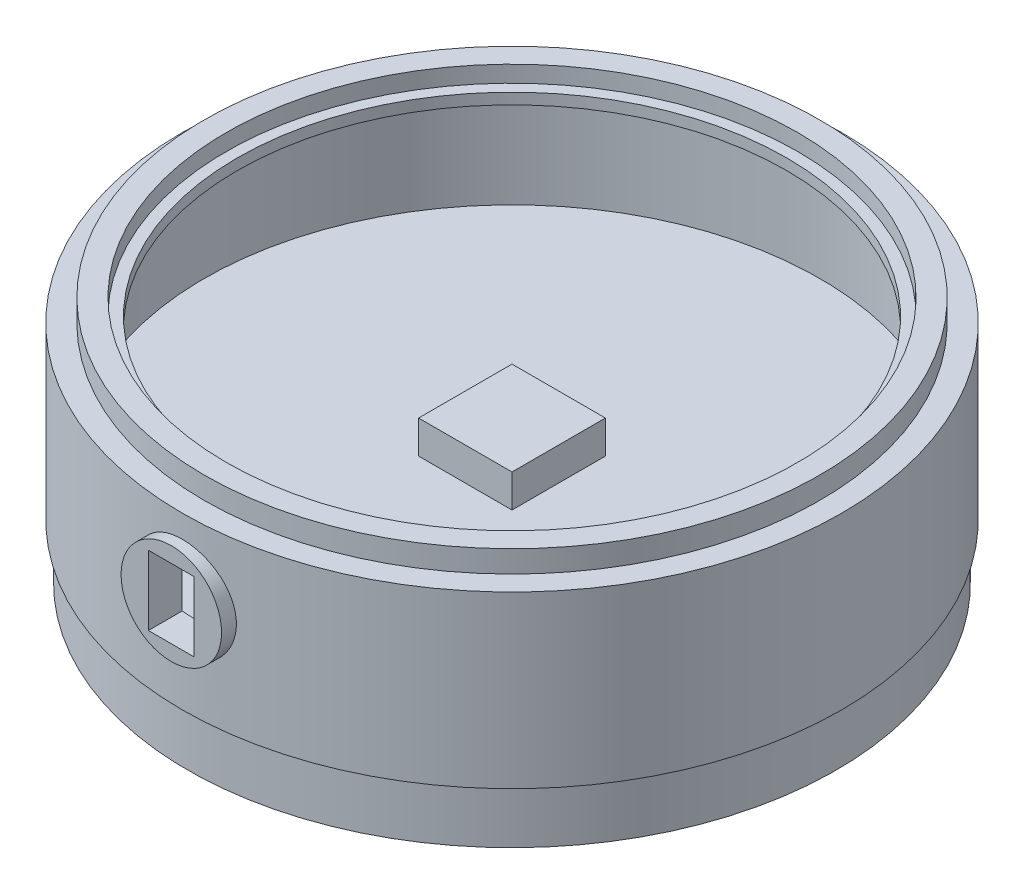
ISO-10303-21;
HEADER;
FILE_DESCRIPTION(('STEP AP214'),'2;1');
FILE_NAME('part.step','',(''),(''),'','','');
FILE_SCHEMA(('AUTOMOTIVE_DESIGN { 1 0 10303 214 1 1 1 1 }'));
ENDSEC;
DATA;
#1=APPLICATION_CONTEXT('core data for automotive mechanical design processes');
#2=APPLICATION_PROTOCOL_DEFINITION('international standard','automotive_design',2000,#1);
#3=PRODUCT_CONTEXT('',#1,'mechanical');
#4=PRODUCT('Part','Part','',(#3));
#5=PRODUCT_RELATED_PRODUCT_CATEGORY('part','',(#4));
#6=PRODUCT_DEFINITION_FORMATION('','',#4);
#7=PRODUCT_DEFINITION_CONTEXT('part definition',#1,'design');
#8=PRODUCT_DEFINITION('design','',#6,#7);
#9=PRODUCT_DEFINITION_SHAPE('','',#8);
#10=(LENGTH_UNIT() NAMED_UNIT(*) SI_UNIT(.MILLI.,.METRE.));
#11=(NAMED_UNIT(*) PLANE_ANGLE_UNIT() SI_UNIT($,.RADIAN.));
#12=(NAMED_UNIT(*) SI_UNIT($,.STERADIAN.) SOLID_ANGLE_UNIT());
#13=UNCERTAINTY_MEASURE_WITH_UNIT(LENGTH_MEASURE(1.E-05),#10,'distance_accuracy_value','');
#14=(GEOMETRIC_REPRESENTATION_CONTEXT(3) GLOBAL_UNCERTAINTY_ASSIGNED_CONTEXT((#13)) GLOBAL_UNIT_ASSIGNED_CONTEXT((#10,
#11,#12)) REPRESENTATION_CONTEXT('',''));
#15=CARTESIAN_POINT('',(0.,0.,0.));
#16=DIRECTION('',(0.,0.,1.));
#17=DIRECTION('',(1.,0.,0.));
#18=AXIS2_PLACEMENT_3D('',#15,#16,#17);
#19=CARTESIAN_POINT('',(0.,1.,0.));
#20=DIRECTION('',(0.,-1.,0.));
#21=DIRECTION('',(0.,0.,-1.));
#22=AXIS2_PLACEMENT_3D('',#19,#20,#21);
#23=CYLINDRICAL_SURFACE('',#22,30.);
#24=CARTESIAN_POINT('',(-4.57128351329621,4.87657137802899,29.6496773513822));
#25=CARTESIAN_POINT('',(-4.57127301041782,4.62140468608867,29.6496816686007));
#26=CARTESIAN_POINT('',(-4.54984634202305,4.36609106832264,29.6530069682925));
#27=CARTESIAN_POINT('',(-4.4647305253347,3.86260558423603,29.6659394465184));
#28=CARTESIAN_POINT('',(-4.40100046115678,3.61444087504676,29.6755527066421));
#29=CARTESIAN_POINT('',(-4.23323175713461,3.13261374106515,29.6999475781639));
#30=CARTESIAN_POINT('',(-4.12922442653793,2.8989402149379,29.7147251742336));
#31=CARTESIAN_POINT('',(-3.88392790063985,2.4523936386219,29.7477788918514));
#32=CARTESIAN_POINT('',(-3.74264370958909,2.23951780168941,29.7660545437109));
#33=CARTESIAN_POINT('',(-3.42555819371333,1.83881951464776,29.8042138943566));
#34=CARTESIAN_POINT('',(-3.2495096359498,1.65119371914194,29.8241084730564));
#35=CARTESIAN_POINT('',(-2.86842668013691,1.30802623278326,29.8631670156701));
#36=CARTESIAN_POINT('',(-2.66339067286469,1.15248632434101,29.8823309389469));
#37=CARTESIAN_POINT('',(-2.2288911866794,0.877178485214907,29.9178829288948));
#38=CARTESIAN_POINT('',(-1.9993115276183,0.757591916891196,29.9342567473633));
#39=CARTESIAN_POINT('',(-1.52303357494446,0.558749501265131,29.9622630597163));
#40=CARTESIAN_POINT('',(-1.27633621496823,0.479491456319482,29.9738958119512));
#41=CARTESIAN_POINT('',(-0.774851902169283,0.36415282088342,29.9910325342108));
#42=CARTESIAN_POINT('',(-0.520142348716236,0.327742760838744,29.9965832475535));
#43=CARTESIAN_POINT('',(-0.00817265953639558,0.298110414592141,30.0010907344831));
#44=CARTESIAN_POINT('',(0.249087329248261,0.30488565456195,30.000047885776));
#45=CARTESIAN_POINT('',(0.756606722920194,0.36117199704645,29.9915230505634));
#46=CARTESIAN_POINT('',(1.00690646531056,0.410328625681076,29.9840944751873));
#47=CARTESIAN_POINT('',(1.49566262949781,0.549425718522067,29.963692372498));
#48=CARTESIAN_POINT('',(1.73411873841662,0.639367259524848,29.9507186987846));
#49=CARTESIAN_POINT('',(2.19348908992412,0.857842503468263,29.9205924443587));
#50=CARTESIAN_POINT('',(2.4143314701812,0.986525000424018,29.9034238006259));
#51=CARTESIAN_POINT('',(2.83142192865304,1.27872064659033,29.8668202285723));
#52=CARTESIAN_POINT('',(3.02766833562262,1.44223616059611,29.8473851464249));
#53=CARTESIAN_POINT('',(3.39208630502824,1.80142975323664,29.808182533445));
#54=CARTESIAN_POINT('',(3.55995277030081,1.99741736387359,29.7884136303538));
#55=CARTESIAN_POINT('',(3.8604621419876,2.41494133315086,29.7509636134504));
#56=CARTESIAN_POINT('',(3.99310481814802,2.63647785878788,29.7332825132865));
#57=CARTESIAN_POINT('',(4.21944514866642,3.09913394997064,29.7020102273075));
#58=CARTESIAN_POINT('',(4.31311070976148,3.34026945858664,29.6884224143846));
#59=CARTESIAN_POINT('',(4.45852715107097,3.83510273441333,29.6669342887907));
#60=CARTESIAN_POINT('',(4.51028108455908,4.08879958509768,29.6590335618186));
#61=CARTESIAN_POINT('',(4.56998520926932,4.5988374388159,29.6498929488384));
#62=CARTESIAN_POINT('',(4.57836822678681,4.85512663708962,29.6485872499266));
#63=CARTESIAN_POINT('',(4.55224171586691,5.36544944156672,29.6526097214045));
#64=CARTESIAN_POINT('',(4.51773356238559,5.61948311981207,29.6579376791402));
#65=CARTESIAN_POINT('',(4.40717163039077,6.11673825471529,29.6745666319488));
#66=CARTESIAN_POINT('',(4.33133412630413,6.3600089300961,29.6858365232762));
#67=CARTESIAN_POINT('',(4.14049146874135,6.83038606048386,29.713053796019));
#68=CARTESIAN_POINT('',(4.02548432429745,7.05749169312247,29.7290014151946));
#69=CARTESIAN_POINT('',(3.75852960978617,7.49103037978089,29.763932006389));
#70=CARTESIAN_POINT('',(3.60630224221289,7.69728929391737,29.7829375775935));
#71=CARTESIAN_POINT('',(3.26961654410956,8.08148809099654,29.8217748273108));
#72=CARTESIAN_POINT('',(3.08515633092791,8.25942631862784,29.841606554026));
#73=CARTESIAN_POINT('',(2.68733336484049,8.58349071200482,29.8800676046522));
#74=CARTESIAN_POINT('',(2.47373543762412,8.72932978785547,29.8986851058355));
#75=CARTESIAN_POINT('',(2.02482075355444,8.98305439128368,29.932435493896));
#76=CARTESIAN_POINT('',(1.7895046064642,9.09094098401028,29.9475684785631));
#77=CARTESIAN_POINT('',(1.30472362846758,9.26524102900487,29.9725930104253));
#78=CARTESIAN_POINT('',(1.05531596360694,9.3318105291861,29.9825042575539));
#79=CARTESIAN_POINT('',(0.548699612394618,9.42209140979869,29.9960513606146));
#80=CARTESIAN_POINT('',(0.29149145966533,9.44580571521041,29.9996876448287));
#81=CARTESIAN_POINT('',(-0.220642073874038,9.44962990792313,30.0002705792239));
#82=CARTESIAN_POINT('',(-0.475564208890887,9.43017872624076,29.9972845688259));
#83=CARTESIAN_POINT('',(-0.97846751650046,9.34916608701204,29.9850944415479));
#84=CARTESIAN_POINT('',(-1.22644871340576,9.28760477698741,29.9758903464514));
#85=CARTESIAN_POINT('',(-1.70830386852594,9.12427686807188,29.952293567605));
#86=CARTESIAN_POINT('',(-1.94218866196511,9.02254161521096,29.9379049298991));
#87=CARTESIAN_POINT('',(-2.38963727848329,8.78180079418725,29.9055181343826));
#88=CARTESIAN_POINT('',(-2.60320039925514,8.64279393856931,29.8875198518912));
#89=CARTESIAN_POINT('',(-3.00616766626774,8.32987288420999,29.8496963114907));
#90=CARTESIAN_POINT('',(-3.1953189464196,8.15563495152314,29.8298551074528));
#91=CARTESIAN_POINT('',(-3.54185748289756,7.77787879636195,29.7906988467171));
#92=CARTESIAN_POINT('',(-3.69923727750896,7.57435371481219,29.7713839145365));
#93=CARTESIAN_POINT('',(-3.97858959559306,7.14240755730821,29.7353465947231));
#94=CARTESIAN_POINT('',(-4.10035101801842,6.91384866210861,29.7186399272385));
#95=CARTESIAN_POINT('',(-4.30357372348156,6.43937478600913,29.6898952233063));
#96=CARTESIAN_POINT('',(-4.38507661678129,6.19347802687491,29.6778523692448));
#97=CARTESIAN_POINT('',(-4.48707986783159,5.76817555734159,29.6625660165613));
#98=CARTESIAN_POINT('',(-4.51860760398284,5.59138994501629,29.6577585618623));
#99=CARTESIAN_POINT('',(-4.5607129761213,5.23528419831546,29.651312733248));
#100=CARTESIAN_POINT('',(-4.57129089725338,5.05596409846992,29.6496743161993));
#101=CARTESIAN_POINT('',(-4.57128351329621,4.87657137802899,29.6496773513822));
#102=B_SPLINE_CURVE_WITH_KNOTS('',3,(#24,#25,#26,#27,#28,#29,#30,#31,#32,#33,#34,#35,#36,#37,
#38,#39,#40,#41,#42,#43,#44,#45,#46,#47,#48,#49,#50,#51,#52,#53,#54,#55,#56,#57,#58,#59,#60,#61,
#62,#63,#64,#65,#66,#67,#68,#69,#70,#71,#72,#73,#74,#75,#76,#77,#78,#79,#80,#81,#82,#83,#84,#85,
#86,#87,#88,#89,#90,#91,#92,#93,#94,#95,#96,#97,#98,#99,#100,#101),.UNSPECIFIED.,.T.,.F.,(4,2,2,
2,2,2,2,2,2,2,2,2,2,2,2,2,2,2,2,2,2,2,2,2,2,2,2,2,2,2,2,2,2,2,2,2,2,2,4),(0.,0.764844334076842,
1.53042950631194,2.29542074708845,3.06030934344287,3.83084733301412,4.60142811540155,
5.37583318435185,6.15019604872141,6.91856489751777,7.68688973144126,8.44885003058193,
9.21083044804199,9.97577560295475,10.7407727061519,11.5135326136685,12.286297572502,
13.0596975631983,13.8330412064211,14.5986520593528,15.3642383698411,16.1258563460655,
16.8875130406233,17.6550816049616,18.422695016333,19.1969175155182,19.9711182841585,
20.742376940156,21.5135829537223,22.2769828782668,23.0403801284548,23.8031829052473,
24.5660120345665,25.3361982691693,26.1065651765113,26.8814094108303,27.6554510999324,
28.1931755666722,28.7308927144729),.UNSPECIFIED.);
#103=CARTESIAN_POINT('',(-4.57128351329621,4.87657137802899,29.6496773513822));
#104=VERTEX_POINT('',#103);
#105=EDGE_CURVE('E58',#104,#104,#102,.T.);
#106=ORIENTED_EDGE('',*,*,#105,.F.);
#107=EDGE_LOOP('',(#106));
#108=FACE_BOUND('',#107,.T.);
#109=CARTESIAN_POINT('',(0.,11.5,0.));
#110=DIRECTION('',(0.,1.,0.));
#111=DIRECTION('',(0.,0.,1.));
#112=AXIS2_PLACEMENT_3D('',#109,#110,#111);
#113=CIRCLE('',#112,30.);
#114=CARTESIAN_POINT('',(0.,11.5,30.));
#115=VERTEX_POINT('',#114);
#116=EDGE_CURVE('E53',#115,#115,#113,.T.);
#117=ORIENTED_EDGE('',*,*,#116,.F.);
#118=EDGE_LOOP('',(#117));
#119=FACE_BOUND('',#118,.T.);
#120=CARTESIAN_POINT('',(0.,-4.,0.));
#121=DIRECTION('',(0.,-1.,0.));
#122=DIRECTION('',(0.,0.,-1.));
#123=AXIS2_PLACEMENT_3D('',#120,#121,#122);
#124=CIRCLE('',#123,30.);
#125=CARTESIAN_POINT('',(0.,-4.,-30.));
#126=VERTEX_POINT('',#125);
#127=EDGE_CURVE('E251',#126,#126,#124,.T.);
#128=ORIENTED_EDGE('',*,*,#127,.F.);
#129=EDGE_LOOP('',(#128));
#130=FACE_BOUND('',#129,.T.);
#131=ADVANCED_FACE('F49',(#108,#119,#130),#23,.T.);
#132=CARTESIAN_POINT('',(0.,13.5,0.));
#133=DIRECTION('',(0.,1.,0.));
#134=DIRECTION('',(0.,0.,1.));
#135=AXIS2_PLACEMENT_3D('',#132,#133,#134);
#136=PLANE('',#135);
#137=CARTESIAN_POINT('',(0.,13.5,0.));
#138=DIRECTION('',(0.,1.,0.));
#139=DIRECTION('',(0.,0.,1.));
#140=AXIS2_PLACEMENT_3D('',#137,#138,#139);
#141=CIRCLE('',#140,26.);
#142=CARTESIAN_POINT('',(0.,13.5,26.));
#143=VERTEX_POINT('',#142);
#144=EDGE_CURVE('E266',#143,#143,#141,.T.);
#145=ORIENTED_EDGE('',*,*,#144,.F.);
#146=EDGE_LOOP('',(#145));
#147=FACE_BOUND('',#146,.T.);
#148=CARTESIAN_POINT('',(0.,13.5,0.));
#149=DIRECTION('',(0.,1.,0.));
#150=DIRECTION('',(0.,0.,1.));
#151=AXIS2_PLACEMENT_3D('',#148,#149,#150);
#152=CIRCLE('',#151,28.);
#153=CARTESIAN_POINT('',(0.,13.5,28.));
#154=VERTEX_POINT('',#153);
#155=EDGE_CURVE('E253',#154,#154,#152,.T.);
#156=ORIENTED_EDGE('',*,*,#155,.T.);
#157=EDGE_LOOP('',(#156));
#158=FACE_BOUND('',#157,.T.);
#159=ADVANCED_FACE('F231',(#147,#158),#136,.T.);
#160=CARTESIAN_POINT('',(0.,12.,0.));
#161=DIRECTION('',(0.,1.,0.));
#162=DIRECTION('',(0.,0.,1.));
#163=AXIS2_PLACEMENT_3D('',#160,#161,#162);
#164=PLANE('',#163);
#165=CARTESIAN_POINT('',(0.,12.,0.));
#166=DIRECTION('',(0.,1.,0.));
#167=DIRECTION('',(0.,0.,1.));
#168=AXIS2_PLACEMENT_3D('',#165,#166,#167);
#169=CIRCLE('',#168,25.);
#170=CARTESIAN_POINT('',(0.,12.,25.));
#171=VERTEX_POINT('',#170);
#172=EDGE_CURVE('E187',#171,#171,#169,.T.);
#173=ORIENTED_EDGE('',*,*,#172,.F.);
#174=EDGE_LOOP('',(#173));
#175=FACE_BOUND('',#174,.T.);
#176=CARTESIAN_POINT('',(0.,12.,0.));
#177=DIRECTION('',(0.,1.,0.));
#178=DIRECTION('',(0.,0.,1.));
#179=AXIS2_PLACEMENT_3D('',#176,#177,#178);
#180=CIRCLE('',#179,26.);
#181=CARTESIAN_POINT('',(0.,12.,26.));
#182=VERTEX_POINT('',#181);
#183=EDGE_CURVE('E270',#182,#182,#180,.T.);
#184=ORIENTED_EDGE('',*,*,#183,.T.);
#185=EDGE_LOOP('',(#184));
#186=FACE_BOUND('',#185,.T.);
#187=ADVANCED_FACE('F226',(#175,#186),#164,.T.);
#188=CARTESIAN_POINT('',(0.,1.,0.));
#189=DIRECTION('',(0.,1.,0.));
#190=DIRECTION('',(0.,0.,1.));
#191=AXIS2_PLACEMENT_3D('',#188,#189,#190);
#192=PLANE('',#191);
#193=CARTESIAN_POINT('',(0.,1.,0.));
#194=DIRECTION('',(0.,1.,0.));
#195=DIRECTION('',(0.,0.,1.));
#196=AXIS2_PLACEMENT_3D('',#193,#194,#195);
#197=CIRCLE('',#196,28.);
#198=CARTESIAN_POINT('',(0.,1.,28.));
#199=VERTEX_POINT('',#198);
#200=EDGE_CURVE('E183',#199,#199,#197,.F.);
#201=ORIENTED_EDGE('',*,*,#200,.F.);
#202=EDGE_LOOP('',(#201));
#203=FACE_BOUND('',#202,.T.);
#204=DIRECTION('',(-1.,0.,0.));
#205=VECTOR('',#204,1.);
#206=CARTESIAN_POINT('',(-4.25,1.,-4.25));
#207=LINE('',#206,#205);
#208=CARTESIAN_POINT('',(4.25,1.,-4.25));
#209=VERTEX_POINT('',#208);
#210=CARTESIAN_POINT('',(-4.25,1.,-4.25));
#211=VERTEX_POINT('',#210);
#212=EDGE_CURVE('E168',#209,#211,#207,.T.);
#213=ORIENTED_EDGE('',*,*,#212,.F.);
#214=DIRECTION('',(0.,0.,-1.));
#215=VECTOR('',#214,1.);
#216=CARTESIAN_POINT('',(4.25,1.,4.25));
#217=LINE('',#216,#215);
#218=CARTESIAN_POINT('',(4.25,1.,4.25));
#219=VERTEX_POINT('',#218);
#220=EDGE_CURVE('E154',#219,#209,#217,.T.);
#221=ORIENTED_EDGE('',*,*,#220,.F.);
#222=DIRECTION('',(1.,0.,0.));
#223=VECTOR('',#222,1.);
#224=CARTESIAN_POINT('',(-4.25,1.,4.25));
#225=LINE('',#224,#223);
#226=CARTESIAN_POINT('',(-4.25,1.,4.25));
#227=VERTEX_POINT('',#226);
#228=EDGE_CURVE('E159',#227,#219,#225,.T.);
#229=ORIENTED_EDGE('',*,*,#228,.F.);
#230=DIRECTION('',(0.,0.,1.));
#231=VECTOR('',#230,1.);
#232=CARTESIAN_POINT('',(-4.25,1.,4.25));
#233=LINE('',#232,#231);
#234=EDGE_CURVE('E170',#211,#227,#233,.T.);
#235=ORIENTED_EDGE('',*,*,#234,.F.);
#236=EDGE_LOOP('',(#213,#221,#229,#235));
#237=FACE_BOUND('',#236,.T.);
#238=ADVANCED_FACE('F223',(#203,#237),#192,.T.);
#239=CARTESIAN_POINT('',(0.,11.,0.));
#240=DIRECTION('',(0.,-1.,0.));
#241=DIRECTION('',(0.,0.,-1.));
#242=AXIS2_PLACEMENT_3D('',#239,#240,#241);
#243=CYLINDRICAL_SURFACE('',#242,28.);
#244=DIRECTION('',(0.,-1.,0.));
#245=VECTOR('',#244,1.);
#246=CARTESIAN_POINT('',(2.08712233169295,11.,27.9221045118836));
#247=LINE('',#246,#245);
#248=CARTESIAN_POINT('',(2.08712233169295,8.03986616200132,27.9221045118836));
#249=VERTEX_POINT('',#248);
#250=CARTESIAN_POINT('',(2.08712233169295,1.71327659405666,27.9221045118836));
#251=VERTEX_POINT('',#250);
#252=EDGE_CURVE('E149',#249,#251,#247,.T.);
#253=ORIENTED_EDGE('',*,*,#252,.F.);
#254=CARTESIAN_POINT('',(0.,8.03986616200132,0.));
#255=DIRECTION('',(0.,1.,0.));
#256=DIRECTION('',(0.,0.,1.));
#257=AXIS2_PLACEMENT_3D('',#254,#255,#256);
#258=CIRCLE('',#257,28.);
#259=CARTESIAN_POINT('',(-2.08712233169295,8.03986616200132,27.9221045118836));
#260=VERTEX_POINT('',#259);
#261=EDGE_CURVE('E142',#260,#249,#258,.T.);
#262=ORIENTED_EDGE('',*,*,#261,.F.);
#263=DIRECTION('',(0.,-1.,0.));
#264=VECTOR('',#263,1.);
#265=CARTESIAN_POINT('',(-2.08712233169295,11.,27.9221045118836));
#266=LINE('',#265,#264);
#267=CARTESIAN_POINT('',(-2.08712233169295,1.71327659405666,27.9221045118836));
#268=VERTEX_POINT('',#267);
#269=EDGE_CURVE('E122',#268,#260,#266,.F.);
#270=ORIENTED_EDGE('',*,*,#269,.F.);
#271=CARTESIAN_POINT('',(0.,1.71327659405666,0.));
#272=DIRECTION('',(0.,-1.,0.));
#273=DIRECTION('',(0.,0.,-1.));
#274=AXIS2_PLACEMENT_3D('',#271,#272,#273);
#275=CIRCLE('',#274,28.);
#276=EDGE_CURVE('E147',#251,#268,#275,.T.);
#277=ORIENTED_EDGE('',*,*,#276,.F.);
#278=EDGE_LOOP('',(#253,#262,#270,#277));
#279=FACE_BOUND('',#278,.T.);
#280=CARTESIAN_POINT('',(0.,11.,0.));
#281=DIRECTION('',(0.,1.,0.));
#282=DIRECTION('',(0.,0.,1.));
#283=AXIS2_PLACEMENT_3D('',#280,#281,#282);
#284=CIRCLE('',#283,28.);
#285=CARTESIAN_POINT('',(0.,11.,28.));
#286=VERTEX_POINT('',#285);
#287=EDGE_CURVE('E184',#286,#286,#284,.T.);
#288=ORIENTED_EDGE('',*,*,#287,.T.);
#289=EDGE_LOOP('',(#288));
#290=FACE_BOUND('',#289,.T.);
#291=ORIENTED_EDGE('',*,*,#200,.T.);
#292=EDGE_LOOP('',(#291));
#293=FACE_BOUND('',#292,.T.);
#294=ADVANCED_FACE('F220',(#279,#290,#293),#243,.F.);
#295=CARTESIAN_POINT('',(4.25,4.,4.25));
#296=DIRECTION('',(-1.,0.,0.));
#297=DIRECTION('',(0.,0.,1.));
#298=AXIS2_PLACEMENT_3D('',#295,#296,#297);
#299=PLANE('',#298);
#300=ORIENTED_EDGE('',*,*,#220,.T.);
#301=DIRECTION('',(0.,-1.,0.));
#302=VECTOR('',#301,1.);
#303=CARTESIAN_POINT('',(4.25,4.,-4.25));
#304=LINE('',#303,#302);
#305=CARTESIAN_POINT('',(4.25,4.,-4.25));
#306=VERTEX_POINT('',#305);
#307=EDGE_CURVE('E181',#306,#209,#304,.T.);
#308=ORIENTED_EDGE('',*,*,#307,.F.);
#309=DIRECTION('',(0.,0.,-1.));
#310=VECTOR('',#309,1.);
#311=CARTESIAN_POINT('',(4.25,4.,4.25));
#312=LINE('',#311,#310);
#313=CARTESIAN_POINT('',(4.25,4.,4.25));
#314=VERTEX_POINT('',#313);
#315=EDGE_CURVE('E155',#314,#306,#312,.T.);
#316=ORIENTED_EDGE('',*,*,#315,.F.);
#317=DIRECTION('',(0.,-1.,0.));
#318=VECTOR('',#317,1.);
#319=CARTESIAN_POINT('',(4.25,4.,4.25));
#320=LINE('',#319,#318);
#321=EDGE_CURVE('E165',#314,#219,#320,.T.);
#322=ORIENTED_EDGE('',*,*,#321,.T.);
#323=EDGE_LOOP('',(#300,#308,#316,#322));
#324=FACE_BOUND('',#323,.T.);
#325=ADVANCED_FACE('F216',(#324),#299,.F.);
#326=CARTESIAN_POINT('',(-4.25,4.,-4.25));
#327=DIRECTION('',(0.,0.,1.));
#328=DIRECTION('',(1.,0.,0.));
#329=AXIS2_PLACEMENT_3D('',#326,#327,#328);
#330=PLANE('',#329);
#331=ORIENTED_EDGE('',*,*,#212,.T.);
#332=DIRECTION('',(0.,-1.,0.));
#333=VECTOR('',#332,1.);
#334=CARTESIAN_POINT('',(-4.25,4.,-4.25));
#335=LINE('',#334,#333);
#336=CARTESIAN_POINT('',(-4.25,4.,-4.25));
#337=VERTEX_POINT('',#336);
#338=EDGE_CURVE('E178',#337,#211,#335,.T.);
#339=ORIENTED_EDGE('',*,*,#338,.F.);
#340=DIRECTION('',(-1.,0.,0.));
#341=VECTOR('',#340,1.);
#342=CARTESIAN_POINT('',(-4.25,4.,-4.25));
#343=LINE('',#342,#341);
#344=EDGE_CURVE('E158',#306,#337,#343,.T.);
#345=ORIENTED_EDGE('',*,*,#344,.F.);
#346=ORIENTED_EDGE('',*,*,#307,.T.);
#347=EDGE_LOOP('',(#331,#339,#345,#346));
#348=FACE_BOUND('',#347,.T.);
#349=ADVANCED_FACE('F212',(#348),#330,.F.);
#350=CARTESIAN_POINT('',(-4.25,4.,4.25));
#351=DIRECTION('',(1.,0.,0.));
#352=DIRECTION('',(0.,0.,-1.));
#353=AXIS2_PLACEMENT_3D('',#350,#351,#352);
#354=PLANE('',#353);
#355=ORIENTED_EDGE('',*,*,#234,.T.);
#356=DIRECTION('',(0.,-1.,0.));
#357=VECTOR('',#356,1.);
#358=CARTESIAN_POINT('',(-4.25,4.,4.25));
#359=LINE('',#358,#357);
#360=CARTESIAN_POINT('',(-4.25,4.,4.25));
#361=VERTEX_POINT('',#360);
#362=EDGE_CURVE('E176',#361,#227,#359,.T.);
#363=ORIENTED_EDGE('',*,*,#362,.F.);
#364=DIRECTION('',(0.,0.,1.));
#365=VECTOR('',#364,1.);
#366=CARTESIAN_POINT('',(-4.25,4.,4.25));
#367=LINE('',#366,#365);
#368=EDGE_CURVE('E161',#337,#361,#367,.T.);
#369=ORIENTED_EDGE('',*,*,#368,.F.);
#370=ORIENTED_EDGE('',*,*,#338,.T.);
#371=EDGE_LOOP('',(#355,#363,#369,#370));
#372=FACE_BOUND('',#371,.T.);
#373=ADVANCED_FACE('F208',(#372),#354,.F.);
#374=CARTESIAN_POINT('',(-4.25,4.,4.25));
#375=DIRECTION('',(0.,0.,-1.));
#376=DIRECTION('',(-1.,0.,0.));
#377=AXIS2_PLACEMENT_3D('',#374,#375,#376);
#378=PLANE('',#377);
#379=ORIENTED_EDGE('',*,*,#228,.T.);
#380=ORIENTED_EDGE('',*,*,#321,.F.);
#381=DIRECTION('',(1.,0.,0.));
#382=VECTOR('',#381,1.);
#383=CARTESIAN_POINT('',(-4.25,4.,4.25));
#384=LINE('',#383,#382);
#385=EDGE_CURVE('E163',#361,#314,#384,.T.);
#386=ORIENTED_EDGE('',*,*,#385,.F.);
#387=ORIENTED_EDGE('',*,*,#362,.T.);
#388=EDGE_LOOP('',(#379,#380,#386,#387));
#389=FACE_BOUND('',#388,.T.);
#390=ADVANCED_FACE('F204',(#389),#378,.F.);
#391=CARTESIAN_POINT('',(0.,4.,0.));
#392=DIRECTION('',(0.,-1.,0.));
#393=DIRECTION('',(0.,0.,-1.));
#394=AXIS2_PLACEMENT_3D('',#391,#392,#393);
#395=PLANE('',#394);
#396=ORIENTED_EDGE('',*,*,#315,.T.);
#397=ORIENTED_EDGE('',*,*,#344,.T.);
#398=ORIENTED_EDGE('',*,*,#368,.T.);
#399=ORIENTED_EDGE('',*,*,#385,.T.);
#400=EDGE_LOOP('',(#396,#397,#398,#399));
#401=FACE_BOUND('',#400,.T.);
#402=ADVANCED_FACE('F199',(#401),#395,.F.);
#403=CARTESIAN_POINT('',(0.,4.87657137802899,31.));
#404=DIRECTION('',(0.,0.,-1.));
#405=DIRECTION('',(-1.,0.,0.));
#406=AXIS2_PLACEMENT_3D('',#403,#404,#405);
#407=CYLINDRICAL_SURFACE('',#406,4.57128351329621);
#408=CARTESIAN_POINT('',(0.,4.87657137802899,31.));
#409=DIRECTION('',(0.,0.,1.));
#410=DIRECTION('',(1.,0.,0.));
#411=AXIS2_PLACEMENT_3D('',#408,#409,#410);
#412=CIRCLE('',#411,4.57128351329621);
#413=CARTESIAN_POINT('',(4.57128351329621,4.87657137802899,31.));
#414=VERTEX_POINT('',#413);
#415=EDGE_CURVE('E151',#414,#414,#412,.T.);
#416=ORIENTED_EDGE('',*,*,#415,.F.);
#417=EDGE_LOOP('',(#416));
#418=FACE_BOUND('',#417,.T.);
#419=ORIENTED_EDGE('',*,*,#105,.T.);
#420=EDGE_LOOP('',(#419));
#421=FACE_BOUND('',#420,.T.);
#422=ADVANCED_FACE('F194',(#418,#421),#407,.T.);
#423=CARTESIAN_POINT('',(0.,4.87657137802899,31.));
#424=DIRECTION('',(0.,0.,1.));
#425=DIRECTION('',(1.,0.,0.));
#426=AXIS2_PLACEMENT_3D('',#423,#424,#425);
#427=PLANE('',#426);
#428=DIRECTION('',(0.,1.,0.));
#429=VECTOR('',#428,1.);
#430=CARTESIAN_POINT('',(2.08712233169295,1.71327659405666,31.));
#431=LINE('',#430,#429);
#432=CARTESIAN_POINT('',(2.08712233169295,1.71327659405666,31.));
#433=VERTEX_POINT('',#432);
#434=CARTESIAN_POINT('',(2.08712233169295,8.03986616200132,31.));
#435=VERTEX_POINT('',#434);
#436=EDGE_CURVE('E74',#433,#435,#431,.T.);
#437=ORIENTED_EDGE('',*,*,#436,.F.);
#438=DIRECTION('',(1.,0.,0.));
#439=VECTOR('',#438,1.);
#440=CARTESIAN_POINT('',(-2.08712233169295,1.71327659405666,31.));
#441=LINE('',#440,#439);
#442=CARTESIAN_POINT('',(-2.08712233169295,1.71327659405666,31.));
#443=VERTEX_POINT('',#442);
#444=EDGE_CURVE('E135',#443,#433,#441,.T.);
#445=ORIENTED_EDGE('',*,*,#444,.F.);
#446=DIRECTION('',(0.,-1.,0.));
#447=VECTOR('',#446,1.);
#448=CARTESIAN_POINT('',(-2.08712233169295,1.71327659405666,31.));
#449=LINE('',#448,#447);
#450=CARTESIAN_POINT('',(-2.08712233169295,8.03986616200132,31.));
#451=VERTEX_POINT('',#450);
#452=EDGE_CURVE('E119',#451,#443,#449,.T.);
#453=ORIENTED_EDGE('',*,*,#452,.F.);
#454=DIRECTION('',(-1.,0.,0.));
#455=VECTOR('',#454,1.);
#456=CARTESIAN_POINT('',(-2.08712233169295,8.03986616200132,31.));
#457=LINE('',#456,#455);
#458=EDGE_CURVE('E128',#435,#451,#457,.T.);
#459=ORIENTED_EDGE('',*,*,#458,.F.);
#460=EDGE_LOOP('',(#437,#445,#453,#459));
#461=FACE_BOUND('',#460,.T.);
#462=ORIENTED_EDGE('',*,*,#415,.T.);
#463=EDGE_LOOP('',(#462));
#464=FACE_BOUND('',#463,.T.);
#465=ADVANCED_FACE('F132',(#461,#464),#427,.T.);
#466=CARTESIAN_POINT('',(2.08712233169295,1.71327659405666,21.));
#467=DIRECTION('',(1.,0.,0.));
#468=DIRECTION('',(0.,0.,-1.));
#469=AXIS2_PLACEMENT_3D('',#466,#467,#468);
#470=PLANE('',#469);
#471=ORIENTED_EDGE('',*,*,#252,.T.);
#472=DIRECTION('',(0.,0.,1.));
#473=VECTOR('',#472,1.);
#474=CARTESIAN_POINT('',(2.08712233169295,1.71327659405666,21.));
#475=LINE('',#474,#473);
#476=EDGE_CURVE('E140',#251,#433,#475,.T.);
#477=ORIENTED_EDGE('',*,*,#476,.T.);
#478=ORIENTED_EDGE('',*,*,#436,.T.);
#479=DIRECTION('',(0.,0.,1.));
#480=VECTOR('',#479,1.);
#481=CARTESIAN_POINT('',(2.08712233169295,8.03986616200132,21.));
#482=LINE('',#481,#480);
#483=EDGE_CURVE('E125',#249,#435,#482,.T.);
#484=ORIENTED_EDGE('',*,*,#483,.F.);
#485=EDGE_LOOP('',(#471,#477,#478,#484));
#486=FACE_BOUND('',#485,.T.);
#487=ADVANCED_FACE('F298',(#486),#470,.F.);
#488=CARTESIAN_POINT('',(-2.08712233169295,1.71327659405666,21.));
#489=DIRECTION('',(0.,-1.,0.));
#490=DIRECTION('',(0.,0.,-1.));
#491=AXIS2_PLACEMENT_3D('',#488,#489,#490);
#492=PLANE('',#491);
#493=ORIENTED_EDGE('',*,*,#276,.T.);
#494=DIRECTION('',(0.,0.,1.));
#495=VECTOR('',#494,1.);
#496=CARTESIAN_POINT('',(-2.08712233169295,1.71327659405666,21.));
#497=LINE('',#496,#495);
#498=EDGE_CURVE('E124',#268,#443,#497,.T.);
#499=ORIENTED_EDGE('',*,*,#498,.T.);
#500=ORIENTED_EDGE('',*,*,#444,.T.);
#501=ORIENTED_EDGE('',*,*,#476,.F.);
#502=EDGE_LOOP('',(#493,#499,#500,#501));
#503=FACE_BOUND('',#502,.T.);
#504=ADVANCED_FACE('F295',(#503),#492,.F.);
#505=CARTESIAN_POINT('',(-2.08712233169295,1.71327659405666,21.));
#506=DIRECTION('',(-1.,0.,0.));
#507=DIRECTION('',(0.,0.,1.));
#508=AXIS2_PLACEMENT_3D('',#505,#506,#507);
#509=PLANE('',#508);
#510=ORIENTED_EDGE('',*,*,#269,.T.);
#511=DIRECTION('',(0.,0.,1.));
#512=VECTOR('',#511,1.);
#513=CARTESIAN_POINT('',(-2.08712233169295,8.03986616200132,21.));
#514=LINE('',#513,#512);
#515=EDGE_CURVE('E66',#260,#451,#514,.T.);
#516=ORIENTED_EDGE('',*,*,#515,.T.);
#517=ORIENTED_EDGE('',*,*,#452,.T.);
#518=ORIENTED_EDGE('',*,*,#498,.F.);
#519=EDGE_LOOP('',(#510,#516,#517,#518));
#520=FACE_BOUND('',#519,.T.);
#521=ADVANCED_FACE('F116',(#520),#509,.F.);
#522=CARTESIAN_POINT('',(-2.08712233169295,8.03986616200132,21.));
#523=DIRECTION('',(0.,1.,0.));
#524=DIRECTION('',(0.,0.,1.));
#525=AXIS2_PLACEMENT_3D('',#522,#523,#524);
#526=PLANE('',#525);
#527=ORIENTED_EDGE('',*,*,#261,.T.);
#528=ORIENTED_EDGE('',*,*,#483,.T.);
#529=ORIENTED_EDGE('',*,*,#458,.T.);
#530=ORIENTED_EDGE('',*,*,#515,.F.);
#531=EDGE_LOOP('',(#527,#528,#529,#530));
#532=FACE_BOUND('',#531,.T.);
#533=ADVANCED_FACE('F129',(#532),#526,.F.);
#534=CARTESIAN_POINT('',(0.,11.,0.));
#535=DIRECTION('',(0.,1.,0.));
#536=DIRECTION('',(0.,0.,1.));
#537=AXIS2_PLACEMENT_3D('',#534,#535,#536);
#538=PLANE('',#537);
#539=CARTESIAN_POINT('',(0.,11.,0.));
#540=DIRECTION('',(0.,1.,0.));
#541=DIRECTION('',(0.,0.,1.));
#542=AXIS2_PLACEMENT_3D('',#539,#540,#541);
#543=CIRCLE('',#542,25.);
#544=CARTESIAN_POINT('',(0.,11.,25.));
#545=VERTEX_POINT('',#544);
#546=EDGE_CURVE('E269',#545,#545,#543,.T.);
#547=ORIENTED_EDGE('',*,*,#546,.T.);
#548=EDGE_LOOP('',(#547));
#549=FACE_BOUND('',#548,.T.);
#550=ORIENTED_EDGE('',*,*,#287,.F.);
#551=EDGE_LOOP('',(#550));
#552=FACE_BOUND('',#551,.T.);
#553=ADVANCED_FACE('F278',(#549,#552),#538,.F.);
#554=CARTESIAN_POINT('',(0.,12.,0.));
#555=DIRECTION('',(0.,-1.,0.));
#556=DIRECTION('',(0.,0.,-1.));
#557=AXIS2_PLACEMENT_3D('',#554,#555,#556);
#558=CYLINDRICAL_SURFACE('',#557,25.);
#559=ORIENTED_EDGE('',*,*,#172,.T.);
#560=EDGE_LOOP('',(#559));
#561=FACE_BOUND('',#560,.T.);
#562=ORIENTED_EDGE('',*,*,#546,.F.);
#563=EDGE_LOOP('',(#562));
#564=FACE_BOUND('',#563,.T.);
#565=ADVANCED_FACE('F281',(#561,#564),#558,.F.);
#566=CARTESIAN_POINT('',(0.,13.5,0.));
#567=DIRECTION('',(0.,-1.,0.));
#568=DIRECTION('',(0.,0.,-1.));
#569=AXIS2_PLACEMENT_3D('',#566,#567,#568);
#570=CYLINDRICAL_SURFACE('',#569,26.);
#571=ORIENTED_EDGE('',*,*,#144,.T.);
#572=EDGE_LOOP('',(#571));
#573=FACE_BOUND('',#572,.T.);
#574=ORIENTED_EDGE('',*,*,#183,.F.);
#575=EDGE_LOOP('',(#574));
#576=FACE_BOUND('',#575,.T.);
#577=ADVANCED_FACE('F283',(#573,#576),#570,.F.);
#578=CARTESIAN_POINT('',(0.,11.5,0.));
#579=DIRECTION('',(0.,1.,0.));
#580=DIRECTION('',(0.,0.,1.));
#581=AXIS2_PLACEMENT_3D('',#578,#579,#580);
#582=PLANE('',#581);
#583=CARTESIAN_POINT('',(0.,11.5,0.));
#584=DIRECTION('',(0.,1.,0.));
#585=DIRECTION('',(0.,0.,1.));
#586=AXIS2_PLACEMENT_3D('',#583,#584,#585);
#587=CIRCLE('',#586,28.);
#588=CARTESIAN_POINT('',(0.,11.5,28.));
#589=VERTEX_POINT('',#588);
#590=EDGE_CURVE('E257',#589,#589,#587,.T.);
#591=ORIENTED_EDGE('',*,*,#590,.F.);
#592=EDGE_LOOP('',(#591));
#593=FACE_BOUND('',#592,.T.);
#594=ORIENTED_EDGE('',*,*,#116,.T.);
#595=EDGE_LOOP('',(#594));
#596=FACE_BOUND('',#595,.T.);
#597=ADVANCED_FACE('F290',(#593,#596),#582,.T.);
#598=CARTESIAN_POINT('',(0.,11.5,0.));
#599=DIRECTION('',(0.,1.,0.));
#600=DIRECTION('',(0.,0.,1.));
#601=AXIS2_PLACEMENT_3D('',#598,#599,#600);
#602=CYLINDRICAL_SURFACE('',#601,28.);
#603=ORIENTED_EDGE('',*,*,#590,.T.);
#604=EDGE_LOOP('',(#603));
#605=FACE_BOUND('',#604,.T.);
#606=ORIENTED_EDGE('',*,*,#155,.F.);
#607=EDGE_LOOP('',(#606));
#608=FACE_BOUND('',#607,.T.);
#609=ADVANCED_FACE('F400',(#605,#608),#602,.T.);
#610=CARTESIAN_POINT('',(0.,-4.,0.));
#611=DIRECTION('',(0.,-1.,0.));
#612=DIRECTION('',(0.,0.,-1.));
#613=AXIS2_PLACEMENT_3D('',#610,#611,#612);
#614=PLANE('',#613);
#615=CARTESIAN_POINT('',(0.,-4.,0.));
#616=DIRECTION('',(0.,-1.,0.));
#617=DIRECTION('',(0.,0.,-1.));
#618=AXIS2_PLACEMENT_3D('',#615,#616,#617);
#619=CIRCLE('',#618,29.5);
#620=CARTESIAN_POINT('',(0.,-4.,-29.5));
#621=VERTEX_POINT('',#620);
#622=EDGE_CURVE('E11',#621,#621,#619,.T.);
#623=ORIENTED_EDGE('',*,*,#622,.F.);
#624=EDGE_LOOP('',(#623));
#625=FACE_BOUND('',#624,.T.);
#626=ORIENTED_EDGE('',*,*,#127,.T.);
#627=EDGE_LOOP('',(#626));
#628=FACE_BOUND('',#627,.T.);
#629=ADVANCED_FACE('F407',(#625,#628),#614,.T.);
#630=CARTESIAN_POINT('',(0.,-9.,0.));
#631=DIRECTION('',(0.,-1.,0.));
#632=DIRECTION('',(0.,0.,-1.));
#633=AXIS2_PLACEMENT_3D('',#630,#631,#632);
#634=PLANE('',#633);
#635=CARTESIAN_POINT('',(10.259615110098,-9.,-17.0345073642229));
#636=DIRECTION('',(0.,-1.,0.));
#637=DIRECTION('',(0.,0.,-1.));
#638=AXIS2_PLACEMENT_3D('',#635,#636,#637);
#639=CIRCLE('',#638,1.5);
#640=CARTESIAN_POINT('',(10.259615110098,-9.,-18.534507364223));
#641=VERTEX_POINT('',#640);
#642=EDGE_CURVE('E518',#641,#641,#639,.T.);
#643=ORIENTED_EDGE('',*,*,#642,.F.);
#644=EDGE_LOOP('',(#643));
#645=FACE_BOUND('',#644,.T.);
#646=CARTESIAN_POINT('',(-10.740384889902,-9.,16.9654926357771));
#647=DIRECTION('',(0.,-1.,0.));
#648=DIRECTION('',(0.,0.,-1.));
#649=AXIS2_PLACEMENT_3D('',#646,#647,#648);
#650=CIRCLE('',#649,1.5);
#651=CARTESIAN_POINT('',(-10.740384889902,-9.,15.4654926357771));
#652=VERTEX_POINT('',#651);
#653=EDGE_CURVE('E526',#652,#652,#650,.T.);
#654=ORIENTED_EDGE('',*,*,#653,.F.);
#655=EDGE_LOOP('',(#654));
#656=FACE_BOUND('',#655,.T.);
#657=CARTESIAN_POINT('',(0.,-9.,0.));
#658=DIRECTION('',(0.,-1.,0.));
#659=DIRECTION('',(0.,0.,-1.));
#660=AXIS2_PLACEMENT_3D('',#657,#658,#659);
#661=CIRCLE('',#660,29.5);
#662=CARTESIAN_POINT('',(0.,-9.,-29.5));
#663=VERTEX_POINT('',#662);
#664=EDGE_CURVE('E529',#663,#663,#661,.T.);
#665=ORIENTED_EDGE('',*,*,#664,.T.);
#666=EDGE_LOOP('',(#665));
#667=FACE_BOUND('',#666,.T.);
#668=CARTESIAN_POINT('',(-10.740384889902,-9.,-17.034507364223));
#669=DIRECTION('',(0.,-1.,0.));
#670=DIRECTION('',(0.,0.,-1.));
#671=AXIS2_PLACEMENT_3D('',#668,#669,#670);
#672=CIRCLE('',#671,1.5);
#673=CARTESIAN_POINT('',(-10.740384889902,-9.,-18.534507364223));
#674=VERTEX_POINT('',#673);
#675=EDGE_CURVE('E521',#674,#674,#672,.T.);
#676=ORIENTED_EDGE('',*,*,#675,.F.);
#677=EDGE_LOOP('',(#676));
#678=FACE_BOUND('',#677,.T.);
#679=CARTESIAN_POINT('',(10.259615110098,-9.,16.9654926357771));
#680=DIRECTION('',(0.,-1.,0.));
#681=DIRECTION('',(0.,0.,-1.));
#682=AXIS2_PLACEMENT_3D('',#679,#680,#681);
#683=CIRCLE('',#682,1.5);
#684=CARTESIAN_POINT('',(10.259615110098,-9.,15.4654926357771));
#685=VERTEX_POINT('',#684);
#686=EDGE_CURVE('E516',#685,#685,#683,.T.);
#687=ORIENTED_EDGE('',*,*,#686,.F.);
#688=EDGE_LOOP('',(#687));
#689=FACE_BOUND('',#688,.T.);
#690=ADVANCED_FACE('F457',(#645,#656,#667,#678,#689),#634,.T.);
#691=CARTESIAN_POINT('',(0.,-9.,0.));
#692=DIRECTION('',(0.,1.,0.));
#693=DIRECTION('',(0.,0.,1.));
#694=AXIS2_PLACEMENT_3D('',#691,#692,#693);
#695=CYLINDRICAL_SURFACE('',#694,29.5);
#696=ORIENTED_EDGE('',*,*,#664,.F.);
#697=EDGE_LOOP('',(#696));
#698=FACE_BOUND('',#697,.T.);
#699=ORIENTED_EDGE('',*,*,#622,.T.);
#700=EDGE_LOOP('',(#699));
#701=FACE_BOUND('',#700,.T.);
#702=ADVANCED_FACE('F418',(#698,#701),#695,.T.);
#703=CARTESIAN_POINT('',(10.259615110098,0.,-17.0345073642229));
#704=DIRECTION('',(0.,-1.,0.));
#705=DIRECTION('',(0.,0.,-1.));
#706=AXIS2_PLACEMENT_3D('',#703,#704,#705);
#707=PLANE('',#706);
#708=CARTESIAN_POINT('',(10.259615110098,0.,-17.0345073642229));
#709=DIRECTION('',(0.,-1.,0.));
#710=DIRECTION('',(0.,0.,-1.));
#711=AXIS2_PLACEMENT_3D('',#708,#709,#710);
#712=CIRCLE('',#711,1.5);
#713=CARTESIAN_POINT('',(10.259615110098,0.,-18.534507364223));
#714=VERTEX_POINT('',#713);
#715=EDGE_CURVE('E254',#714,#714,#712,.T.);
#716=ORIENTED_EDGE('',*,*,#715,.T.);
#717=EDGE_LOOP('',(#716));
#718=FACE_BOUND('',#717,.T.);
#719=ADVANCED_FACE('F413',(#718),#707,.T.);
#720=CARTESIAN_POINT('',(10.259615110098,0.,-17.0345073642229));
#721=DIRECTION('',(0.,-1.,0.));
#722=DIRECTION('',(0.,0.,-1.));
#723=AXIS2_PLACEMENT_3D('',#720,#721,#722);
#724=CYLINDRICAL_SURFACE('',#723,1.5);
#725=ORIENTED_EDGE('',*,*,#715,.F.);
#726=EDGE_LOOP('',(#725));
#727=FACE_BOUND('',#726,.T.);
#728=ORIENTED_EDGE('',*,*,#642,.T.);
#729=EDGE_LOOP('',(#728));
#730=FACE_BOUND('',#729,.T.);
#731=ADVANCED_FACE('F417',(#727,#730),#724,.F.);
#732=CARTESIAN_POINT('',(-10.740384889902,0.,-17.034507364223));
#733=DIRECTION('',(0.,1.,0.));
#734=DIRECTION('',(0.,0.,1.));
#735=AXIS2_PLACEMENT_3D('',#732,#733,#734);
#736=PLANE('',#735);
#737=CARTESIAN_POINT('',(-10.740384889902,0.,-17.034507364223));
#738=DIRECTION('',(0.,-1.,0.));
#739=DIRECTION('',(0.,0.,1.));
#740=AXIS2_PLACEMENT_3D('',#737,#738,#739);
#741=CIRCLE('',#740,1.5);
#742=CARTESIAN_POINT('',(-10.740384889902,0.,-15.534507364223));
#743=VERTEX_POINT('',#742);
#744=EDGE_CURVE('E260',#743,#743,#741,.T.);
#745=ORIENTED_EDGE('',*,*,#744,.T.);
#746=EDGE_LOOP('',(#745));
#747=FACE_BOUND('',#746,.T.);
#748=ADVANCED_FACE('F425',(#747),#736,.F.);
#749=CARTESIAN_POINT('',(-10.740384889902,0.,-17.034507364223));
#750=DIRECTION('',(0.,-1.,0.));
#751=DIRECTION('',(0.,0.,-1.));
#752=AXIS2_PLACEMENT_3D('',#749,#750,#751);
#753=CYLINDRICAL_SURFACE('',#752,1.5);
#754=ORIENTED_EDGE('',*,*,#744,.F.);
#755=EDGE_LOOP('',(#754));
#756=FACE_BOUND('',#755,.T.);
#757=ORIENTED_EDGE('',*,*,#675,.T.);
#758=EDGE_LOOP('',(#757));
#759=FACE_BOUND('',#758,.T.);
#760=ADVANCED_FACE('F429',(#756,#759),#753,.F.);
#761=CARTESIAN_POINT('',(-10.740384889902,0.,16.9654926357771));
#762=DIRECTION('',(0.,-1.,0.));
#763=DIRECTION('',(0.,0.,-1.));
#764=AXIS2_PLACEMENT_3D('',#761,#762,#763);
#765=PLANE('',#764);
#766=CARTESIAN_POINT('',(-10.740384889902,0.,16.9654926357771));
#767=DIRECTION('',(0.,-1.,0.));
#768=DIRECTION('',(0.,0.,-1.));
#769=AXIS2_PLACEMENT_3D('',#766,#767,#768);
#770=CIRCLE('',#769,1.5);
#771=CARTESIAN_POINT('',(-10.740384889902,0.,15.4654926357771));
#772=VERTEX_POINT('',#771);
#773=EDGE_CURVE('E534',#772,#772,#770,.T.);
#774=ORIENTED_EDGE('',*,*,#773,.T.);
#775=EDGE_LOOP('',(#774));
#776=FACE_BOUND('',#775,.T.);
#777=ADVANCED_FACE('F435',(#776),#765,.T.);
#778=CARTESIAN_POINT('',(-10.740384889902,0.,16.9654926357771));
#779=DIRECTION('',(0.,-1.,0.));
#780=DIRECTION('',(0.,0.,-1.));
#781=AXIS2_PLACEMENT_3D('',#778,#779,#780);
#782=CYLINDRICAL_SURFACE('',#781,1.5);
#783=ORIENTED_EDGE('',*,*,#773,.F.);
#784=EDGE_LOOP('',(#783));
#785=FACE_BOUND('',#784,.T.);
#786=ORIENTED_EDGE('',*,*,#653,.T.);
#787=EDGE_LOOP('',(#786));
#788=FACE_BOUND('',#787,.T.);
#789=ADVANCED_FACE('F439',(#785,#788),#782,.F.);
#790=CARTESIAN_POINT('',(10.259615110098,0.,16.9654926357771));
#791=DIRECTION('',(0.,1.,0.));
#792=DIRECTION('',(0.,0.,1.));
#793=AXIS2_PLACEMENT_3D('',#790,#791,#792);
#794=PLANE('',#793);
#795=CARTESIAN_POINT('',(10.259615110098,0.,16.9654926357771));
#796=DIRECTION('',(0.,-1.,0.));
#797=DIRECTION('',(0.,0.,1.));
#798=AXIS2_PLACEMENT_3D('',#795,#796,#797);
#799=CIRCLE('',#798,1.5);
#800=CARTESIAN_POINT('',(10.259615110098,0.,18.4654926357771));
#801=VERTEX_POINT('',#800);
#802=EDGE_CURVE('E513',#801,#801,#799,.T.);
#803=ORIENTED_EDGE('',*,*,#802,.T.);
#804=EDGE_LOOP('',(#803));
#805=FACE_BOUND('',#804,.T.);
#806=ADVANCED_FACE('F445',(#805),#794,.F.);
#807=CARTESIAN_POINT('',(10.259615110098,0.,16.9654926357771));
#808=DIRECTION('',(0.,-1.,0.));
#809=DIRECTION('',(0.,0.,-1.));
#810=AXIS2_PLACEMENT_3D('',#807,#808,#809);
#811=CYLINDRICAL_SURFACE('',#810,1.5);
#812=ORIENTED_EDGE('',*,*,#802,.F.);
#813=EDGE_LOOP('',(#812));
#814=FACE_BOUND('',#813,.T.);
#815=ORIENTED_EDGE('',*,*,#686,.T.);
#816=EDGE_LOOP('',(#815));
#817=FACE_BOUND('',#816,.T.);
#818=ADVANCED_FACE('F449',(#814,#817),#811,.F.);
#819=CLOSED_SHELL('',(#131,#159,#187,#238,#294,#325,#349,#373,#390,#402,#422,#465,#487,#504,
#521,#533,#553,#565,#577,#597,#609,#629,#690,#702,#719,#731,#748,#760,#777,#789,#806,#818));
#820=MANIFOLD_SOLID_BREP('B2',#819);
#821=ADVANCED_BREP_SHAPE_REPRESENTATION('',(#18,#820),#14);
#822=SHAPE_DEFINITION_REPRESENTATION(#9,#821);
ENDSEC;
END-ISO-10303-21;
